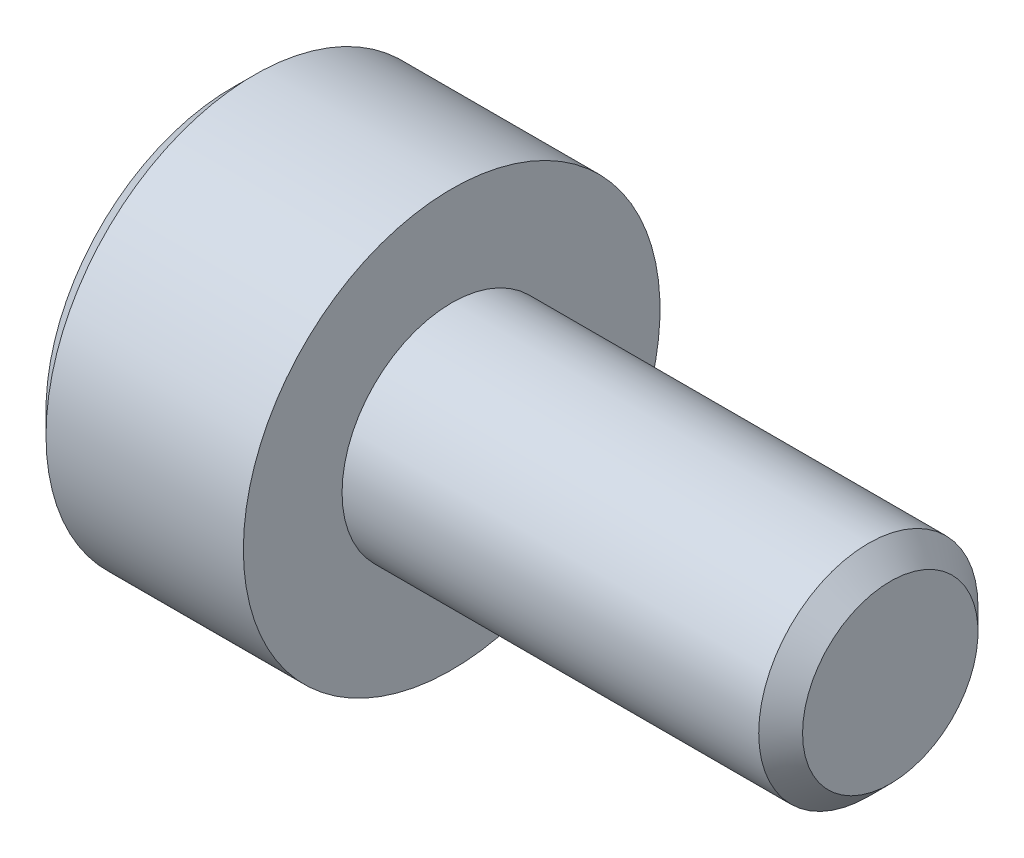
ISO-10303-21;
HEADER;
FILE_DESCRIPTION(('STEP AP214'),'2;1');
FILE_NAME('part.step','',(''),(''),'','','');
FILE_SCHEMA(('AUTOMOTIVE_DESIGN { 1 0 10303 214 1 1 1 1 }'));
ENDSEC;
DATA;
#1=APPLICATION_CONTEXT('core data for automotive mechanical design processes');
#2=APPLICATION_PROTOCOL_DEFINITION('international standard','automotive_design',2000,#1);
#3=PRODUCT_CONTEXT('',#1,'mechanical');
#4=PRODUCT('Part','Part','',(#3));
#5=PRODUCT_RELATED_PRODUCT_CATEGORY('part','',(#4));
#6=PRODUCT_DEFINITION_FORMATION('','',#4);
#7=PRODUCT_DEFINITION_CONTEXT('part definition',#1,'design');
#8=PRODUCT_DEFINITION('design','',#6,#7);
#9=PRODUCT_DEFINITION_SHAPE('','',#8);
#10=(LENGTH_UNIT() NAMED_UNIT(*) SI_UNIT(.MILLI.,.METRE.));
#11=(NAMED_UNIT(*) PLANE_ANGLE_UNIT() SI_UNIT($,.RADIAN.));
#12=(NAMED_UNIT(*) SI_UNIT($,.STERADIAN.) SOLID_ANGLE_UNIT());
#13=UNCERTAINTY_MEASURE_WITH_UNIT(LENGTH_MEASURE(1.E-05),#10,'distance_accuracy_value','');
#14=(GEOMETRIC_REPRESENTATION_CONTEXT(3) GLOBAL_UNCERTAINTY_ASSIGNED_CONTEXT((#13)) GLOBAL_UNIT_ASSIGNED_CONTEXT((#10,
#11,#12)) REPRESENTATION_CONTEXT('',''));
#15=CARTESIAN_POINT('',(0.,0.,0.));
#16=DIRECTION('',(0.,0.,1.));
#17=DIRECTION('',(1.,0.,0.));
#18=AXIS2_PLACEMENT_3D('',#15,#16,#17);
#19=CARTESIAN_POINT('',(6.,0.,0.));
#20=DIRECTION('',(-1.,0.,0.));
#21=DIRECTION('',(0.,0.,1.));
#22=AXIS2_PLACEMENT_3D('',#19,#20,#21);
#23=PLANE('',#22);
#24=CARTESIAN_POINT('',(6.,0.,0.));
#25=DIRECTION('',(-1.,0.,0.));
#26=DIRECTION('',(0.,0.,1.));
#27=AXIS2_PLACEMENT_3D('',#24,#25,#26);
#28=CIRCLE('',#27,0.8);
#29=CARTESIAN_POINT('',(6.,0.,0.8));
#30=VERTEX_POINT('',#29);
#31=EDGE_CURVE('E148',#30,#30,#28,.F.);
#32=ORIENTED_EDGE('',*,*,#31,.T.);
#33=EDGE_LOOP('',(#32));
#34=FACE_BOUND('',#33,.T.);
#35=ADVANCED_FACE('F32',(#34),#23,.F.);
#36=CARTESIAN_POINT('',(0.,0.,0.));
#37=DIRECTION('',(-1.,0.,0.));
#38=DIRECTION('',(0.,0.,1.));
#39=AXIS2_PLACEMENT_3D('',#36,#37,#38);
#40=CYLINDRICAL_SURFACE('',#39,0.999999999999999);
#41=CARTESIAN_POINT('',(5.8,0.,0.));
#42=DIRECTION('',(-1.,0.,0.));
#43=DIRECTION('',(0.,0.,1.));
#44=AXIS2_PLACEMENT_3D('',#41,#42,#43);
#45=CIRCLE('',#44,0.999999999999999);
#46=CARTESIAN_POINT('',(5.8,0.,0.999999999999999));
#47=VERTEX_POINT('',#46);
#48=EDGE_CURVE('E145',#47,#47,#45,.T.);
#49=ORIENTED_EDGE('',*,*,#48,.T.);
#50=EDGE_LOOP('',(#49));
#51=FACE_BOUND('',#50,.T.);
#52=CARTESIAN_POINT('',(2.,0.,0.));
#53=DIRECTION('',(-1.,0.,0.));
#54=DIRECTION('',(0.,0.,1.));
#55=AXIS2_PLACEMENT_3D('',#52,#53,#54);
#56=CIRCLE('',#55,0.999999999999997);
#57=CARTESIAN_POINT('',(2.,0.,0.999999999999997));
#58=VERTEX_POINT('',#57);
#59=EDGE_CURVE('E142',#58,#58,#56,.T.);
#60=ORIENTED_EDGE('',*,*,#59,.F.);
#61=EDGE_LOOP('',(#60));
#62=FACE_BOUND('',#61,.T.);
#63=ADVANCED_FACE('F165',(#51,#62),#40,.T.);
#64=CARTESIAN_POINT('',(2.,0.999999999999997,0.));
#65=DIRECTION('',(-1.,0.,0.));
#66=DIRECTION('',(0.,0.,1.));
#67=AXIS2_PLACEMENT_3D('',#64,#65,#66);
#68=PLANE('',#67);
#69=CARTESIAN_POINT('',(2.,0.,0.));
#70=DIRECTION('',(-1.,0.,0.));
#71=DIRECTION('',(0.,0.,1.));
#72=AXIS2_PLACEMENT_3D('',#69,#70,#71);
#73=CIRCLE('',#72,1.9);
#74=CARTESIAN_POINT('',(2.,0.,1.9));
#75=VERTEX_POINT('',#74);
#76=EDGE_CURVE('E134',#75,#75,#73,.T.);
#77=ORIENTED_EDGE('',*,*,#76,.F.);
#78=EDGE_LOOP('',(#77));
#79=FACE_BOUND('',#78,.T.);
#80=ORIENTED_EDGE('',*,*,#59,.T.);
#81=EDGE_LOOP('',(#80));
#82=FACE_BOUND('',#81,.T.);
#83=ADVANCED_FACE('F171',(#79,#82),#68,.F.);
#84=CARTESIAN_POINT('',(0.,0.,0.));
#85=DIRECTION('',(-1.,0.,0.));
#86=DIRECTION('',(0.,0.,1.));
#87=AXIS2_PLACEMENT_3D('',#84,#85,#86);
#88=CYLINDRICAL_SURFACE('',#87,1.9);
#89=CARTESIAN_POINT('',(0.200000000000001,0.,0.));
#90=DIRECTION('',(1.,0.,0.));
#91=DIRECTION('',(0.,0.,-1.));
#92=AXIS2_PLACEMENT_3D('',#89,#90,#91);
#93=CIRCLE('',#92,1.9);
#94=CARTESIAN_POINT('',(0.200000000000001,0.,-1.9));
#95=VERTEX_POINT('',#94);
#96=EDGE_CURVE('E11',#95,#95,#93,.T.);
#97=ORIENTED_EDGE('',*,*,#96,.T.);
#98=EDGE_LOOP('',(#97));
#99=FACE_BOUND('',#98,.T.);
#100=ORIENTED_EDGE('',*,*,#76,.T.);
#101=EDGE_LOOP('',(#100));
#102=FACE_BOUND('',#101,.T.);
#103=ADVANCED_FACE('F177',(#99,#102),#88,.T.);
#104=CARTESIAN_POINT('',(0.,1.9,0.));
#105=DIRECTION('',(1.,0.,0.));
#106=DIRECTION('',(0.,0.,-1.));
#107=AXIS2_PLACEMENT_3D('',#104,#105,#106);
#108=PLANE('',#107);
#109=CARTESIAN_POINT('',(0.,0.,0.));
#110=DIRECTION('',(1.,0.,0.));
#111=DIRECTION('',(0.,0.,-1.));
#112=AXIS2_PLACEMENT_3D('',#109,#110,#111);
#113=CIRCLE('',#112,1.7);
#114=CARTESIAN_POINT('',(0.,0.,-1.7));
#115=VERTEX_POINT('',#114);
#116=EDGE_CURVE('E40',#115,#115,#113,.F.);
#117=ORIENTED_EDGE('',*,*,#116,.T.);
#118=EDGE_LOOP('',(#117));
#119=FACE_BOUND('',#118,.T.);
#120=DIRECTION('',(0.,0.866025403784439,0.5));
#121=VECTOR('',#120,1.);
#122=CARTESIAN_POINT('',(0.,-1.10893966894747,0.640246616381875));
#123=LINE('',#122,#121);
#124=CARTESIAN_POINT('',(0.,-1.10893966894747,0.640246616381875));
#125=VERTEX_POINT('',#124);
#126=CARTESIAN_POINT('',(0.,0.,1.28049323276375));
#127=VERTEX_POINT('',#126);
#128=EDGE_CURVE('E121',#125,#127,#123,.T.);
#129=ORIENTED_EDGE('',*,*,#128,.F.);
#130=DIRECTION('',(0.,0.,1.));
#131=VECTOR('',#130,1.);
#132=CARTESIAN_POINT('',(0.,-1.10893966894747,-0.640246616381875));
#133=LINE('',#132,#131);
#134=CARTESIAN_POINT('',(0.,-1.10893966894747,-0.640246616381875));
#135=VERTEX_POINT('',#134);
#136=EDGE_CURVE('E47',#135,#125,#133,.T.);
#137=ORIENTED_EDGE('',*,*,#136,.F.);
#138=DIRECTION('',(0.,-0.866025403784439,0.5));
#139=VECTOR('',#138,1.);
#140=CARTESIAN_POINT('',(0.,0.,-1.28049323276375));
#141=LINE('',#140,#139);
#142=CARTESIAN_POINT('',(0.,0.,-1.28049323276375));
#143=VERTEX_POINT('',#142);
#144=EDGE_CURVE('E130',#143,#135,#141,.T.);
#145=ORIENTED_EDGE('',*,*,#144,.F.);
#146=DIRECTION('',(0.,-0.866025403784439,-0.5));
#147=VECTOR('',#146,1.);
#148=CARTESIAN_POINT('',(0.,1.10893966894747,-0.640246616381875));
#149=LINE('',#148,#147);
#150=CARTESIAN_POINT('',(0.,1.10893966894747,-0.640246616381875));
#151=VERTEX_POINT('',#150);
#152=EDGE_CURVE('E128',#151,#143,#149,.T.);
#153=ORIENTED_EDGE('',*,*,#152,.F.);
#154=DIRECTION('',(0.,0.,-1.));
#155=VECTOR('',#154,1.);
#156=CARTESIAN_POINT('',(0.,1.10893966894747,0.640246616381875));
#157=LINE('',#156,#155);
#158=CARTESIAN_POINT('',(0.,1.10893966894747,0.640246616381875));
#159=VERTEX_POINT('',#158);
#160=EDGE_CURVE('E95',#159,#151,#157,.T.);
#161=ORIENTED_EDGE('',*,*,#160,.F.);
#162=DIRECTION('',(0.,0.866025403784439,-0.5));
#163=VECTOR('',#162,1.);
#164=CARTESIAN_POINT('',(0.,0.,1.28049323276375));
#165=LINE('',#164,#163);
#166=EDGE_CURVE('E124',#127,#159,#165,.T.);
#167=ORIENTED_EDGE('',*,*,#166,.F.);
#168=EDGE_LOOP('',(#129,#137,#145,#153,#161,#167));
#169=FACE_BOUND('',#168,.T.);
#170=ADVANCED_FACE('F153',(#119,#169),#108,.F.);
#171=CARTESIAN_POINT('',(1.27,-1.10893966894747,-0.640246616381875));
#172=DIRECTION('',(0.,-1.,0.));
#173=DIRECTION('',(0.,0.,-1.));
#174=AXIS2_PLACEMENT_3D('',#171,#172,#173);
#175=PLANE('',#174);
#176=ORIENTED_EDGE('',*,*,#136,.T.);
#177=DIRECTION('',(-1.,0.,0.));
#178=VECTOR('',#177,1.);
#179=CARTESIAN_POINT('',(1.27,-1.10893966894747,0.640246616381875));
#180=LINE('',#179,#178);
#181=CARTESIAN_POINT('',(1.27,-1.10893966894747,0.640246616381875));
#182=VERTEX_POINT('',#181);
#183=EDGE_CURVE('E77',#182,#125,#180,.T.);
#184=ORIENTED_EDGE('',*,*,#183,.F.);
#185=DIRECTION('',(0.,0.,1.));
#186=VECTOR('',#185,1.);
#187=CARTESIAN_POINT('',(1.27,-1.10893966894747,-0.640246616381875));
#188=LINE('',#187,#186);
#189=CARTESIAN_POINT('',(1.27,-1.10893966894747,-0.640246616381875));
#190=VERTEX_POINT('',#189);
#191=EDGE_CURVE('E132',#190,#182,#188,.T.);
#192=ORIENTED_EDGE('',*,*,#191,.F.);
#193=DIRECTION('',(-1.,0.,0.));
#194=VECTOR('',#193,1.);
#195=CARTESIAN_POINT('',(1.27,-1.10893966894747,-0.640246616381875));
#196=LINE('',#195,#194);
#197=EDGE_CURVE('E55',#190,#135,#196,.T.);
#198=ORIENTED_EDGE('',*,*,#197,.T.);
#199=EDGE_LOOP('',(#176,#184,#192,#198));
#200=FACE_BOUND('',#199,.T.);
#201=ADVANCED_FACE('F184',(#200),#175,.F.);
#202=CARTESIAN_POINT('',(1.27,0.,-1.28049323276375));
#203=DIRECTION('',(0.,-0.5,-0.866025403784439));
#204=DIRECTION('',(0.,0.866025403784439,-0.5));
#205=AXIS2_PLACEMENT_3D('',#202,#203,#204);
#206=PLANE('',#205);
#207=ORIENTED_EDGE('',*,*,#144,.T.);
#208=ORIENTED_EDGE('',*,*,#197,.F.);
#209=DIRECTION('',(0.,-0.866025403784439,0.5));
#210=VECTOR('',#209,1.);
#211=CARTESIAN_POINT('',(1.27,0.,-1.28049323276375));
#212=LINE('',#211,#210);
#213=CARTESIAN_POINT('',(1.27,0.,-1.28049323276375));
#214=VERTEX_POINT('',#213);
#215=EDGE_CURVE('E107',#214,#190,#212,.T.);
#216=ORIENTED_EDGE('',*,*,#215,.F.);
#217=DIRECTION('',(-1.,0.,0.));
#218=VECTOR('',#217,1.);
#219=CARTESIAN_POINT('',(1.27,0.,-1.28049323276375));
#220=LINE('',#219,#218);
#221=EDGE_CURVE('E99',#214,#143,#220,.T.);
#222=ORIENTED_EDGE('',*,*,#221,.T.);
#223=EDGE_LOOP('',(#207,#208,#216,#222));
#224=FACE_BOUND('',#223,.T.);
#225=ADVANCED_FACE('F187',(#224),#206,.F.);
#226=CARTESIAN_POINT('',(1.27,1.10893966894747,-0.640246616381875));
#227=DIRECTION('',(0.,0.5,-0.866025403784439));
#228=DIRECTION('',(0.,0.866025403784439,0.5));
#229=AXIS2_PLACEMENT_3D('',#226,#227,#228);
#230=PLANE('',#229);
#231=ORIENTED_EDGE('',*,*,#152,.T.);
#232=ORIENTED_EDGE('',*,*,#221,.F.);
#233=DIRECTION('',(0.,-0.866025403784439,-0.5));
#234=VECTOR('',#233,1.);
#235=CARTESIAN_POINT('',(1.27,1.10893966894747,-0.640246616381875));
#236=LINE('',#235,#234);
#237=CARTESIAN_POINT('',(1.27,1.10893966894747,-0.640246616381875));
#238=VERTEX_POINT('',#237);
#239=EDGE_CURVE('E103',#238,#214,#236,.T.);
#240=ORIENTED_EDGE('',*,*,#239,.F.);
#241=DIRECTION('',(-1.,0.,0.));
#242=VECTOR('',#241,1.);
#243=CARTESIAN_POINT('',(1.27,1.10893966894747,-0.640246616381875));
#244=LINE('',#243,#242);
#245=EDGE_CURVE('E88',#238,#151,#244,.T.);
#246=ORIENTED_EDGE('',*,*,#245,.T.);
#247=EDGE_LOOP('',(#231,#232,#240,#246));
#248=FACE_BOUND('',#247,.T.);
#249=ADVANCED_FACE('F104',(#248),#230,.F.);
#250=CARTESIAN_POINT('',(1.27,1.10893966894747,0.640246616381875));
#251=DIRECTION('',(0.,1.,0.));
#252=DIRECTION('',(0.,0.,1.));
#253=AXIS2_PLACEMENT_3D('',#250,#251,#252);
#254=PLANE('',#253);
#255=ORIENTED_EDGE('',*,*,#160,.T.);
#256=ORIENTED_EDGE('',*,*,#245,.F.);
#257=DIRECTION('',(0.,0.,-1.));
#258=VECTOR('',#257,1.);
#259=CARTESIAN_POINT('',(1.27,1.10893966894747,0.640246616381875));
#260=LINE('',#259,#258);
#261=CARTESIAN_POINT('',(1.27,1.10893966894747,0.640246616381875));
#262=VERTEX_POINT('',#261);
#263=EDGE_CURVE('E92',#262,#238,#260,.T.);
#264=ORIENTED_EDGE('',*,*,#263,.F.);
#265=DIRECTION('',(-1.,0.,0.));
#266=VECTOR('',#265,1.);
#267=CARTESIAN_POINT('',(1.27,1.10893966894747,0.640246616381875));
#268=LINE('',#267,#266);
#269=EDGE_CURVE('E100',#262,#159,#268,.T.);
#270=ORIENTED_EDGE('',*,*,#269,.T.);
#271=EDGE_LOOP('',(#255,#256,#264,#270));
#272=FACE_BOUND('',#271,.T.);
#273=ADVANCED_FACE('F90',(#272),#254,.F.);
#274=CARTESIAN_POINT('',(1.27,0.,1.28049323276375));
#275=DIRECTION('',(0.,0.5,0.866025403784439));
#276=DIRECTION('',(0.,-0.866025403784439,0.5));
#277=AXIS2_PLACEMENT_3D('',#274,#275,#276);
#278=PLANE('',#277);
#279=ORIENTED_EDGE('',*,*,#166,.T.);
#280=ORIENTED_EDGE('',*,*,#269,.F.);
#281=DIRECTION('',(0.,0.866025403784439,-0.5));
#282=VECTOR('',#281,1.);
#283=CARTESIAN_POINT('',(1.27,0.,1.28049323276375));
#284=LINE('',#283,#282);
#285=CARTESIAN_POINT('',(1.27,0.,1.28049323276375));
#286=VERTEX_POINT('',#285);
#287=EDGE_CURVE('E113',#286,#262,#284,.T.);
#288=ORIENTED_EDGE('',*,*,#287,.F.);
#289=DIRECTION('',(-1.,0.,0.));
#290=VECTOR('',#289,1.);
#291=CARTESIAN_POINT('',(1.27,0.,1.28049323276375));
#292=LINE('',#291,#290);
#293=EDGE_CURVE('E137',#286,#127,#292,.T.);
#294=ORIENTED_EDGE('',*,*,#293,.T.);
#295=EDGE_LOOP('',(#279,#280,#288,#294));
#296=FACE_BOUND('',#295,.T.);
#297=ADVANCED_FACE('F191',(#296),#278,.F.);
#298=CARTESIAN_POINT('',(1.27,-1.10893966894747,0.640246616381875));
#299=DIRECTION('',(0.,-0.5,0.866025403784439));
#300=DIRECTION('',(0.,-0.866025403784439,-0.5));
#301=AXIS2_PLACEMENT_3D('',#298,#299,#300);
#302=PLANE('',#301);
#303=ORIENTED_EDGE('',*,*,#128,.T.);
#304=ORIENTED_EDGE('',*,*,#293,.F.);
#305=DIRECTION('',(0.,0.866025403784439,0.5));
#306=VECTOR('',#305,1.);
#307=CARTESIAN_POINT('',(1.27,-1.10893966894747,0.640246616381875));
#308=LINE('',#307,#306);
#309=EDGE_CURVE('E115',#182,#286,#308,.T.);
#310=ORIENTED_EDGE('',*,*,#309,.F.);
#311=ORIENTED_EDGE('',*,*,#183,.T.);
#312=EDGE_LOOP('',(#303,#304,#310,#311));
#313=FACE_BOUND('',#312,.T.);
#314=ADVANCED_FACE('F188',(#313),#302,.F.);
#315=CARTESIAN_POINT('',(1.27,0.,0.));
#316=DIRECTION('',(-1.,0.,0.));
#317=DIRECTION('',(0.,0.,1.));
#318=AXIS2_PLACEMENT_3D('',#315,#316,#317);
#319=PLANE('',#318);
#320=ORIENTED_EDGE('',*,*,#191,.T.);
#321=ORIENTED_EDGE('',*,*,#309,.T.);
#322=ORIENTED_EDGE('',*,*,#287,.T.);
#323=ORIENTED_EDGE('',*,*,#263,.T.);
#324=ORIENTED_EDGE('',*,*,#239,.T.);
#325=ORIENTED_EDGE('',*,*,#215,.T.);
#326=EDGE_LOOP('',(#320,#321,#322,#323,#324,#325));
#327=FACE_BOUND('',#326,.T.);
#328=ADVANCED_FACE('F110',(#327),#319,.T.);
#329=CARTESIAN_POINT('',(5.8,0.,0.));
#330=DIRECTION('',(-1.,0.,0.));
#331=DIRECTION('',(0.,0.,1.));
#332=AXIS2_PLACEMENT_3D('',#329,#330,#331);
#333=CONICAL_SURFACE('',#332,0.999999999999999,0.785398163397451);
#334=ORIENTED_EDGE('',*,*,#31,.F.);
#335=EDGE_LOOP('',(#334));
#336=FACE_BOUND('',#335,.T.);
#337=ORIENTED_EDGE('',*,*,#48,.F.);
#338=EDGE_LOOP('',(#337));
#339=FACE_BOUND('',#338,.T.);
#340=ADVANCED_FACE('F157',(#336,#339),#333,.T.);
#341=CARTESIAN_POINT('',(0.,0.,0.));
#342=DIRECTION('',(1.,0.,0.));
#343=DIRECTION('',(0.,0.,-1.));
#344=AXIS2_PLACEMENT_3D('',#341,#342,#343);
#345=CONICAL_SURFACE('',#344,1.7,0.785398163397446);
#346=ORIENTED_EDGE('',*,*,#96,.F.);
#347=EDGE_LOOP('',(#346));
#348=FACE_BOUND('',#347,.T.);
#349=ORIENTED_EDGE('',*,*,#116,.F.);
#350=EDGE_LOOP('',(#349));
#351=FACE_BOUND('',#350,.T.);
#352=ADVANCED_FACE('F34',(#348,#351),#345,.T.);
#353=CLOSED_SHELL('',(#35,#63,#83,#103,#170,#201,#225,#249,#273,#297,#314,#328,#340,#352));
#354=MANIFOLD_SOLID_BREP('B2',#353);
#355=ADVANCED_BREP_SHAPE_REPRESENTATION('',(#18,#354),#14);
#356=SHAPE_DEFINITION_REPRESENTATION(#9,#355);
ENDSEC;
END-ISO-10303-21;
